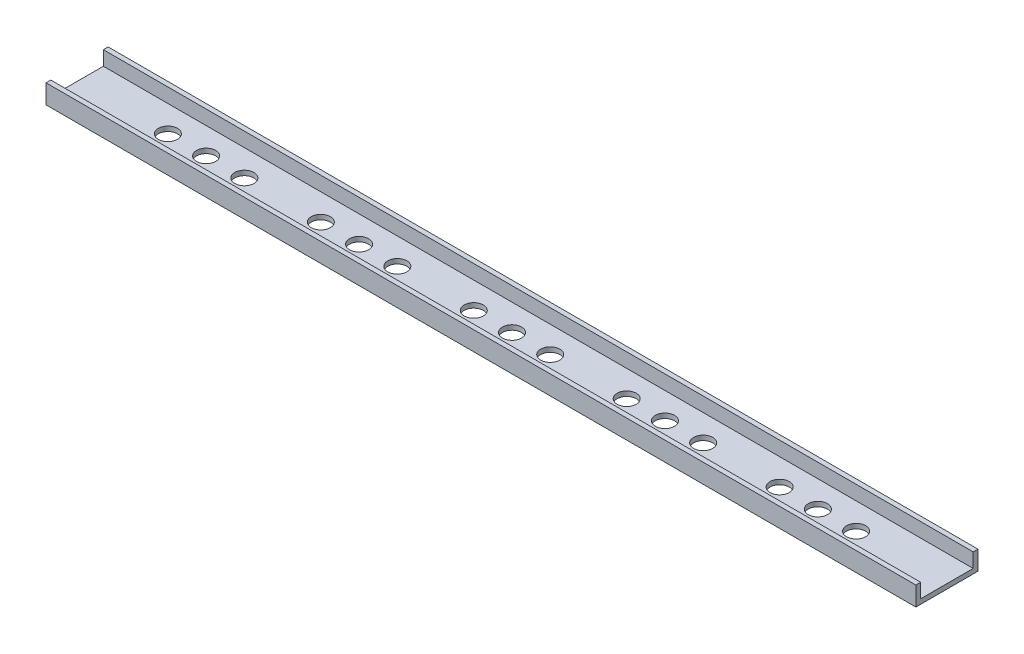
ISO-10303-21;
HEADER;
FILE_DESCRIPTION(('STEP AP214'),'2;1');
FILE_NAME('part.step','',(''),(''),'','','');
FILE_SCHEMA(('AUTOMOTIVE_DESIGN { 1 0 10303 214 1 1 1 1 }'));
ENDSEC;
DATA;
#1=APPLICATION_CONTEXT('core data for automotive mechanical design processes');
#2=APPLICATION_PROTOCOL_DEFINITION('international standard','automotive_design',2000,#1);
#3=PRODUCT_CONTEXT('',#1,'mechanical');
#4=PRODUCT('Part','Part','',(#3));
#5=PRODUCT_RELATED_PRODUCT_CATEGORY('part','',(#4));
#6=PRODUCT_DEFINITION_FORMATION('','',#4);
#7=PRODUCT_DEFINITION_CONTEXT('part definition',#1,'design');
#8=PRODUCT_DEFINITION('design','',#6,#7);
#9=PRODUCT_DEFINITION_SHAPE('','',#8);
#10=(LENGTH_UNIT() NAMED_UNIT(*) SI_UNIT(.MILLI.,.METRE.));
#11=(NAMED_UNIT(*) PLANE_ANGLE_UNIT() SI_UNIT($,.RADIAN.));
#12=(NAMED_UNIT(*) SI_UNIT($,.STERADIAN.) SOLID_ANGLE_UNIT());
#13=UNCERTAINTY_MEASURE_WITH_UNIT(LENGTH_MEASURE(1.E-05),#10,'distance_accuracy_value','');
#14=(GEOMETRIC_REPRESENTATION_CONTEXT(3) GLOBAL_UNCERTAINTY_ASSIGNED_CONTEXT((#13)) GLOBAL_UNIT_ASSIGNED_CONTEXT((#10,
#11,#12)) REPRESENTATION_CONTEXT('',''));
#15=CARTESIAN_POINT('',(0.,0.,0.));
#16=DIRECTION('',(0.,0.,1.));
#17=DIRECTION('',(1.,0.,0.));
#18=AXIS2_PLACEMENT_3D('',#15,#16,#17);
#19=CARTESIAN_POINT('',(0.,1.,0.));
#20=DIRECTION('',(0.,1.,0.));
#21=DIRECTION('',(0.,0.,1.));
#22=AXIS2_PLACEMENT_3D('',#19,#20,#21);
#23=PLANE('',#22);
#24=CARTESIAN_POINT('',(64.,1.,-44.1536914511489));
#25=DIRECTION('',(0.,1.,0.));
#26=DIRECTION('',(0.,0.,1.));
#27=AXIS2_PLACEMENT_3D('',#24,#25,#26);
#28=CIRCLE('',#27,2.);
#29=CARTESIAN_POINT('',(64.,1.,-42.1536914511489));
#30=VERTEX_POINT('',#29);
#31=EDGE_CURVE('E151',#30,#30,#28,.T.);
#32=ORIENTED_EDGE('',*,*,#31,.F.);
#33=EDGE_LOOP('',(#32));
#34=FACE_BOUND('',#33,.T.);
#35=CARTESIAN_POINT('',(-7.99999999999998,1.,-44.1536914511489));
#36=DIRECTION('',(0.,1.,0.));
#37=DIRECTION('',(0.,0.,-1.));
#38=AXIS2_PLACEMENT_3D('',#35,#36,#37);
#39=CIRCLE('',#38,2.);
#40=CARTESIAN_POINT('',(-7.99999999999998,1.,-46.1536914511489));
#41=VERTEX_POINT('',#40);
#42=EDGE_CURVE('E163',#41,#41,#39,.T.);
#43=ORIENTED_EDGE('',*,*,#42,.F.);
#44=EDGE_LOOP('',(#43));
#45=FACE_BOUND('',#44,.T.);
#46=CARTESIAN_POINT('',(8.00000000000003,1.,-44.1536914511489));
#47=DIRECTION('',(0.,1.,0.));
#48=DIRECTION('',(0.,0.,-1.));
#49=AXIS2_PLACEMENT_3D('',#46,#47,#48);
#50=CIRCLE('',#49,2.);
#51=CARTESIAN_POINT('',(8.00000000000003,1.,-46.1536914511489));
#52=VERTEX_POINT('',#51);
#53=EDGE_CURVE('E175',#52,#52,#50,.T.);
#54=ORIENTED_EDGE('',*,*,#53,.F.);
#55=EDGE_LOOP('',(#54));
#56=FACE_BOUND('',#55,.T.);
#57=CARTESIAN_POINT('',(32.,1.,-44.1536914511489));
#58=DIRECTION('',(0.,1.,0.));
#59=DIRECTION('',(0.,0.,-1.));
#60=AXIS2_PLACEMENT_3D('',#57,#58,#59);
#61=CIRCLE('',#60,2.);
#62=CARTESIAN_POINT('',(32.,1.,-46.1536914511489));
#63=VERTEX_POINT('',#62);
#64=EDGE_CURVE('E187',#63,#63,#61,.T.);
#65=ORIENTED_EDGE('',*,*,#64,.F.);
#66=EDGE_LOOP('',(#65));
#67=FACE_BOUND('',#66,.T.);
#68=CARTESIAN_POINT('',(-24.,1.,-44.1536914511489));
#69=DIRECTION('',(0.,1.,0.));
#70=DIRECTION('',(0.,0.,1.));
#71=AXIS2_PLACEMENT_3D('',#68,#69,#70);
#72=CIRCLE('',#71,2.);
#73=CARTESIAN_POINT('',(-24.,1.,-42.1536914511489));
#74=VERTEX_POINT('',#73);
#75=EDGE_CURVE('E199',#74,#74,#72,.T.);
#76=ORIENTED_EDGE('',*,*,#75,.F.);
#77=EDGE_LOOP('',(#76));
#78=FACE_BOUND('',#77,.T.);
#79=CARTESIAN_POINT('',(-40.,1.,-44.1536914511489));
#80=DIRECTION('',(0.,1.,0.));
#81=DIRECTION('',(0.,0.,1.));
#82=AXIS2_PLACEMENT_3D('',#79,#80,#81);
#83=CIRCLE('',#82,2.);
#84=CARTESIAN_POINT('',(-40.,1.,-42.1536914511489));
#85=VERTEX_POINT('',#84);
#86=EDGE_CURVE('E211',#85,#85,#83,.T.);
#87=ORIENTED_EDGE('',*,*,#86,.F.);
#88=EDGE_LOOP('',(#87));
#89=FACE_BOUND('',#88,.T.);
#90=CARTESIAN_POINT('',(-64.,1.,-44.1536914511489));
#91=DIRECTION('',(0.,1.,0.));
#92=DIRECTION('',(0.,0.,1.));
#93=AXIS2_PLACEMENT_3D('',#90,#91,#92);
#94=CIRCLE('',#93,2.);
#95=CARTESIAN_POINT('',(-64.,1.,-42.1536914511489));
#96=VERTEX_POINT('',#95);
#97=EDGE_CURVE('E223',#96,#96,#94,.T.);
#98=ORIENTED_EDGE('',*,*,#97,.F.);
#99=EDGE_LOOP('',(#98));
#100=FACE_BOUND('',#99,.T.);
#101=CARTESIAN_POINT('',(-72.,1.,-44.1536914511489));
#102=DIRECTION('',(0.,1.,0.));
#103=DIRECTION('',(0.,0.,1.));
#104=AXIS2_PLACEMENT_3D('',#101,#102,#103);
#105=CIRCLE('',#104,2.);
#106=CARTESIAN_POINT('',(-72.,1.,-42.1536914511489));
#107=VERTEX_POINT('',#106);
#108=EDGE_CURVE('E229',#107,#107,#105,.T.);
#109=ORIENTED_EDGE('',*,*,#108,.F.);
#110=EDGE_LOOP('',(#109));
#111=FACE_BOUND('',#110,.T.);
#112=CARTESIAN_POINT('',(-56.,1.,-44.1536914511489));
#113=DIRECTION('',(0.,1.,0.));
#114=DIRECTION('',(0.,0.,1.));
#115=AXIS2_PLACEMENT_3D('',#112,#113,#114);
#116=CIRCLE('',#115,2.);
#117=CARTESIAN_POINT('',(-56.,1.,-42.1536914511489));
#118=VERTEX_POINT('',#117);
#119=EDGE_CURVE('E217',#118,#118,#116,.T.);
#120=ORIENTED_EDGE('',*,*,#119,.F.);
#121=EDGE_LOOP('',(#120));
#122=FACE_BOUND('',#121,.T.);
#123=CARTESIAN_POINT('',(-32.,1.,-44.1536914511489));
#124=DIRECTION('',(0.,1.,0.));
#125=DIRECTION('',(0.,0.,1.));
#126=AXIS2_PLACEMENT_3D('',#123,#124,#125);
#127=CIRCLE('',#126,2.);
#128=CARTESIAN_POINT('',(-32.,1.,-42.1536914511489));
#129=VERTEX_POINT('',#128);
#130=EDGE_CURVE('E205',#129,#129,#127,.T.);
#131=ORIENTED_EDGE('',*,*,#130,.F.);
#132=EDGE_LOOP('',(#131));
#133=FACE_BOUND('',#132,.T.);
#134=CARTESIAN_POINT('',(40.,1.,-44.1536914511489));
#135=DIRECTION('',(0.,1.,0.));
#136=DIRECTION('',(0.,0.,-1.));
#137=AXIS2_PLACEMENT_3D('',#134,#135,#136);
#138=CIRCLE('',#137,2.);
#139=CARTESIAN_POINT('',(40.,1.,-46.1536914511489));
#140=VERTEX_POINT('',#139);
#141=EDGE_CURVE('E193',#140,#140,#138,.T.);
#142=ORIENTED_EDGE('',*,*,#141,.F.);
#143=EDGE_LOOP('',(#142));
#144=FACE_BOUND('',#143,.T.);
#145=CARTESIAN_POINT('',(24.,1.,-44.1536914511489));
#146=DIRECTION('',(0.,1.,0.));
#147=DIRECTION('',(0.,0.,-1.));
#148=AXIS2_PLACEMENT_3D('',#145,#146,#147);
#149=CIRCLE('',#148,2.);
#150=CARTESIAN_POINT('',(24.,1.,-46.1536914511489));
#151=VERTEX_POINT('',#150);
#152=EDGE_CURVE('E181',#151,#151,#149,.T.);
#153=ORIENTED_EDGE('',*,*,#152,.F.);
#154=EDGE_LOOP('',(#153));
#155=FACE_BOUND('',#154,.T.);
#156=CARTESIAN_POINT('',(0.,1.,-44.1536914511489));
#157=DIRECTION('',(0.,1.,0.));
#158=DIRECTION('',(0.,0.,-1.));
#159=AXIS2_PLACEMENT_3D('',#156,#157,#158);
#160=CIRCLE('',#159,2.);
#161=CARTESIAN_POINT('',(0.,1.,-46.1536914511489));
#162=VERTEX_POINT('',#161);
#163=EDGE_CURVE('E169',#162,#162,#160,.T.);
#164=ORIENTED_EDGE('',*,*,#163,.F.);
#165=EDGE_LOOP('',(#164));
#166=FACE_BOUND('',#165,.T.);
#167=CARTESIAN_POINT('',(72.,1.,-44.1536914511489));
#168=DIRECTION('',(0.,1.,0.));
#169=DIRECTION('',(0.,0.,1.));
#170=AXIS2_PLACEMENT_3D('',#167,#168,#169);
#171=CIRCLE('',#170,2.);
#172=CARTESIAN_POINT('',(72.,1.,-42.1536914511489));
#173=VERTEX_POINT('',#172);
#174=EDGE_CURVE('E157',#173,#173,#171,.T.);
#175=ORIENTED_EDGE('',*,*,#174,.F.);
#176=EDGE_LOOP('',(#175));
#177=FACE_BOUND('',#176,.T.);
#178=CARTESIAN_POINT('',(56.,1.,-44.1536914511489));
#179=DIRECTION('',(0.,1.,0.));
#180=DIRECTION('',(0.,0.,1.));
#181=AXIS2_PLACEMENT_3D('',#178,#179,#180);
#182=CIRCLE('',#181,2.);
#183=CARTESIAN_POINT('',(56.,1.,-42.1536914511489));
#184=VERTEX_POINT('',#183);
#185=EDGE_CURVE('E145',#184,#184,#182,.T.);
#186=ORIENTED_EDGE('',*,*,#185,.F.);
#187=EDGE_LOOP('',(#186));
#188=FACE_BOUND('',#187,.T.);
#189=DIRECTION('',(0.,0.,1.));
#190=VECTOR('',#189,1.);
#191=CARTESIAN_POINT('',(-91.,1.,-50.6536914511489));
#192=LINE('',#191,#190);
#193=CARTESIAN_POINT('',(-91.,1.,-49.6536914511489));
#194=VERTEX_POINT('',#193);
#195=CARTESIAN_POINT('',(-91.,1.,-38.6536914511489));
#196=VERTEX_POINT('',#195);
#197=EDGE_CURVE('E49',#194,#196,#192,.T.);
#198=ORIENTED_EDGE('',*,*,#197,.T.);
#199=DIRECTION('',(-1.,0.,0.));
#200=VECTOR('',#199,1.);
#201=CARTESIAN_POINT('',(91.,1.,-38.6536914511489));
#202=LINE('',#201,#200);
#203=CARTESIAN_POINT('',(91.,1.,-38.6536914511489));
#204=VERTEX_POINT('',#203);
#205=EDGE_CURVE('E118',#204,#196,#202,.T.);
#206=ORIENTED_EDGE('',*,*,#205,.F.);
#207=DIRECTION('',(0.,0.,-1.));
#208=VECTOR('',#207,1.);
#209=CARTESIAN_POINT('',(91.,1.,-50.6536914511489));
#210=LINE('',#209,#208);
#211=CARTESIAN_POINT('',(91.,1.,-49.6536914511489));
#212=VERTEX_POINT('',#211);
#213=EDGE_CURVE('E122',#204,#212,#210,.T.);
#214=ORIENTED_EDGE('',*,*,#213,.T.);
#215=DIRECTION('',(1.,0.,0.));
#216=VECTOR('',#215,1.);
#217=CARTESIAN_POINT('',(-91.,1.,-49.6536914511489));
#218=LINE('',#217,#216);
#219=EDGE_CURVE('E54',#194,#212,#218,.T.);
#220=ORIENTED_EDGE('',*,*,#219,.F.);
#221=EDGE_LOOP('',(#198,#206,#214,#220));
#222=FACE_BOUND('',#221,.T.);
#223=ADVANCED_FACE('F34',(#34,#45,#56,#67,#78,#89,#100,#111,#122,#133,#144,#155,#166,#177,#188,
#222),#23,.T.);
#224=CARTESIAN_POINT('',(0.,0.,0.));
#225=DIRECTION('',(0.,1.,0.));
#226=DIRECTION('',(0.,0.,1.));
#227=AXIS2_PLACEMENT_3D('',#224,#225,#226);
#228=PLANE('',#227);
#229=DIRECTION('',(0.,0.,1.));
#230=VECTOR('',#229,1.);
#231=CARTESIAN_POINT('',(-91.,0.,-50.6536914511489));
#232=LINE('',#231,#230);
#233=CARTESIAN_POINT('',(-91.,0.,-50.6536914511489));
#234=VERTEX_POINT('',#233);
#235=CARTESIAN_POINT('',(-91.,0.,-37.6536914511489));
#236=VERTEX_POINT('',#235);
#237=EDGE_CURVE('E232',#234,#236,#232,.T.);
#238=ORIENTED_EDGE('',*,*,#237,.F.);
#239=DIRECTION('',(-1.,0.,0.));
#240=VECTOR('',#239,1.);
#241=CARTESIAN_POINT('',(-91.,0.,-50.6536914511489));
#242=LINE('',#241,#240);
#243=CARTESIAN_POINT('',(91.,0.,-50.6536914511489));
#244=VERTEX_POINT('',#243);
#245=EDGE_CURVE('E236',#244,#234,#242,.T.);
#246=ORIENTED_EDGE('',*,*,#245,.F.);
#247=DIRECTION('',(0.,0.,-1.));
#248=VECTOR('',#247,1.);
#249=CARTESIAN_POINT('',(91.,0.,-50.6536914511489));
#250=LINE('',#249,#248);
#251=CARTESIAN_POINT('',(91.,0.,-37.6536914511489));
#252=VERTEX_POINT('',#251);
#253=EDGE_CURVE('E243',#252,#244,#250,.T.);
#254=ORIENTED_EDGE('',*,*,#253,.F.);
#255=DIRECTION('',(1.,0.,0.));
#256=VECTOR('',#255,1.);
#257=CARTESIAN_POINT('',(-91.,0.,-37.6536914511489));
#258=LINE('',#257,#256);
#259=EDGE_CURVE('E241',#236,#252,#258,.T.);
#260=ORIENTED_EDGE('',*,*,#259,.F.);
#261=EDGE_LOOP('',(#238,#246,#254,#260));
#262=FACE_BOUND('',#261,.T.);
#263=CARTESIAN_POINT('',(-72.,0.,-44.1536914511489));
#264=DIRECTION('',(0.,1.,0.));
#265=DIRECTION('',(0.,0.,1.));
#266=AXIS2_PLACEMENT_3D('',#263,#264,#265);
#267=CIRCLE('',#266,2.);
#268=CARTESIAN_POINT('',(-72.,0.,-42.1536914511489));
#269=VERTEX_POINT('',#268);
#270=EDGE_CURVE('E226',#269,#269,#267,.T.);
#271=ORIENTED_EDGE('',*,*,#270,.T.);
#272=EDGE_LOOP('',(#271));
#273=FACE_BOUND('',#272,.T.);
#274=CARTESIAN_POINT('',(-64.,0.,-44.1536914511489));
#275=DIRECTION('',(0.,1.,0.));
#276=DIRECTION('',(0.,0.,1.));
#277=AXIS2_PLACEMENT_3D('',#274,#275,#276);
#278=CIRCLE('',#277,2.);
#279=CARTESIAN_POINT('',(-64.,0.,-42.1536914511489));
#280=VERTEX_POINT('',#279);
#281=EDGE_CURVE('E220',#280,#280,#278,.T.);
#282=ORIENTED_EDGE('',*,*,#281,.T.);
#283=EDGE_LOOP('',(#282));
#284=FACE_BOUND('',#283,.T.);
#285=CARTESIAN_POINT('',(-56.,0.,-44.1536914511489));
#286=DIRECTION('',(0.,1.,0.));
#287=DIRECTION('',(0.,0.,1.));
#288=AXIS2_PLACEMENT_3D('',#285,#286,#287);
#289=CIRCLE('',#288,2.);
#290=CARTESIAN_POINT('',(-56.,0.,-42.1536914511489));
#291=VERTEX_POINT('',#290);
#292=EDGE_CURVE('E214',#291,#291,#289,.T.);
#293=ORIENTED_EDGE('',*,*,#292,.T.);
#294=EDGE_LOOP('',(#293));
#295=FACE_BOUND('',#294,.T.);
#296=CARTESIAN_POINT('',(-40.,0.,-44.1536914511489));
#297=DIRECTION('',(0.,1.,0.));
#298=DIRECTION('',(0.,0.,1.));
#299=AXIS2_PLACEMENT_3D('',#296,#297,#298);
#300=CIRCLE('',#299,2.);
#301=CARTESIAN_POINT('',(-40.,0.,-42.1536914511489));
#302=VERTEX_POINT('',#301);
#303=EDGE_CURVE('E208',#302,#302,#300,.T.);
#304=ORIENTED_EDGE('',*,*,#303,.T.);
#305=EDGE_LOOP('',(#304));
#306=FACE_BOUND('',#305,.T.);
#307=CARTESIAN_POINT('',(-32.,0.,-44.1536914511489));
#308=DIRECTION('',(0.,1.,0.));
#309=DIRECTION('',(0.,0.,1.));
#310=AXIS2_PLACEMENT_3D('',#307,#308,#309);
#311=CIRCLE('',#310,2.);
#312=CARTESIAN_POINT('',(-32.,0.,-42.1536914511489));
#313=VERTEX_POINT('',#312);
#314=EDGE_CURVE('E202',#313,#313,#311,.T.);
#315=ORIENTED_EDGE('',*,*,#314,.T.);
#316=EDGE_LOOP('',(#315));
#317=FACE_BOUND('',#316,.T.);
#318=CARTESIAN_POINT('',(-24.,0.,-44.1536914511489));
#319=DIRECTION('',(0.,1.,0.));
#320=DIRECTION('',(0.,0.,1.));
#321=AXIS2_PLACEMENT_3D('',#318,#319,#320);
#322=CIRCLE('',#321,2.);
#323=CARTESIAN_POINT('',(-24.,0.,-42.1536914511489));
#324=VERTEX_POINT('',#323);
#325=EDGE_CURVE('E196',#324,#324,#322,.T.);
#326=ORIENTED_EDGE('',*,*,#325,.T.);
#327=EDGE_LOOP('',(#326));
#328=FACE_BOUND('',#327,.T.);
#329=CARTESIAN_POINT('',(40.,0.,-44.1536914511489));
#330=DIRECTION('',(0.,1.,0.));
#331=DIRECTION('',(0.,0.,-1.));
#332=AXIS2_PLACEMENT_3D('',#329,#330,#331);
#333=CIRCLE('',#332,2.);
#334=CARTESIAN_POINT('',(40.,0.,-46.1536914511489));
#335=VERTEX_POINT('',#334);
#336=EDGE_CURVE('E190',#335,#335,#333,.T.);
#337=ORIENTED_EDGE('',*,*,#336,.T.);
#338=EDGE_LOOP('',(#337));
#339=FACE_BOUND('',#338,.T.);
#340=CARTESIAN_POINT('',(32.,0.,-44.1536914511489));
#341=DIRECTION('',(0.,1.,0.));
#342=DIRECTION('',(0.,0.,-1.));
#343=AXIS2_PLACEMENT_3D('',#340,#341,#342);
#344=CIRCLE('',#343,2.);
#345=CARTESIAN_POINT('',(32.,0.,-46.1536914511489));
#346=VERTEX_POINT('',#345);
#347=EDGE_CURVE('E184',#346,#346,#344,.T.);
#348=ORIENTED_EDGE('',*,*,#347,.T.);
#349=EDGE_LOOP('',(#348));
#350=FACE_BOUND('',#349,.T.);
#351=CARTESIAN_POINT('',(24.,0.,-44.1536914511489));
#352=DIRECTION('',(0.,1.,0.));
#353=DIRECTION('',(0.,0.,-1.));
#354=AXIS2_PLACEMENT_3D('',#351,#352,#353);
#355=CIRCLE('',#354,2.);
#356=CARTESIAN_POINT('',(24.,0.,-46.1536914511489));
#357=VERTEX_POINT('',#356);
#358=EDGE_CURVE('E178',#357,#357,#355,.T.);
#359=ORIENTED_EDGE('',*,*,#358,.T.);
#360=EDGE_LOOP('',(#359));
#361=FACE_BOUND('',#360,.T.);
#362=CARTESIAN_POINT('',(8.00000000000003,0.,-44.1536914511489));
#363=DIRECTION('',(0.,1.,0.));
#364=DIRECTION('',(0.,0.,-1.));
#365=AXIS2_PLACEMENT_3D('',#362,#363,#364);
#366=CIRCLE('',#365,2.);
#367=CARTESIAN_POINT('',(8.00000000000003,0.,-46.1536914511489));
#368=VERTEX_POINT('',#367);
#369=EDGE_CURVE('E172',#368,#368,#366,.T.);
#370=ORIENTED_EDGE('',*,*,#369,.T.);
#371=EDGE_LOOP('',(#370));
#372=FACE_BOUND('',#371,.T.);
#373=CARTESIAN_POINT('',(0.,0.,-44.1536914511489));
#374=DIRECTION('',(0.,1.,0.));
#375=DIRECTION('',(0.,0.,-1.));
#376=AXIS2_PLACEMENT_3D('',#373,#374,#375);
#377=CIRCLE('',#376,2.);
#378=CARTESIAN_POINT('',(0.,0.,-46.1536914511489));
#379=VERTEX_POINT('',#378);
#380=EDGE_CURVE('E166',#379,#379,#377,.T.);
#381=ORIENTED_EDGE('',*,*,#380,.T.);
#382=EDGE_LOOP('',(#381));
#383=FACE_BOUND('',#382,.T.);
#384=CARTESIAN_POINT('',(-7.99999999999998,0.,-44.1536914511489));
#385=DIRECTION('',(0.,1.,0.));
#386=DIRECTION('',(0.,0.,-1.));
#387=AXIS2_PLACEMENT_3D('',#384,#385,#386);
#388=CIRCLE('',#387,2.);
#389=CARTESIAN_POINT('',(-7.99999999999998,0.,-46.1536914511489));
#390=VERTEX_POINT('',#389);
#391=EDGE_CURVE('E160',#390,#390,#388,.T.);
#392=ORIENTED_EDGE('',*,*,#391,.T.);
#393=EDGE_LOOP('',(#392));
#394=FACE_BOUND('',#393,.T.);
#395=CARTESIAN_POINT('',(72.,0.,-44.1536914511489));
#396=DIRECTION('',(0.,1.,0.));
#397=DIRECTION('',(0.,0.,1.));
#398=AXIS2_PLACEMENT_3D('',#395,#396,#397);
#399=CIRCLE('',#398,2.);
#400=CARTESIAN_POINT('',(72.,0.,-42.1536914511489));
#401=VERTEX_POINT('',#400);
#402=EDGE_CURVE('E154',#401,#401,#399,.T.);
#403=ORIENTED_EDGE('',*,*,#402,.T.);
#404=EDGE_LOOP('',(#403));
#405=FACE_BOUND('',#404,.T.);
#406=CARTESIAN_POINT('',(64.,0.,-44.1536914511489));
#407=DIRECTION('',(0.,1.,0.));
#408=DIRECTION('',(0.,0.,1.));
#409=AXIS2_PLACEMENT_3D('',#406,#407,#408);
#410=CIRCLE('',#409,2.);
#411=CARTESIAN_POINT('',(64.,0.,-42.1536914511489));
#412=VERTEX_POINT('',#411);
#413=EDGE_CURVE('E148',#412,#412,#410,.T.);
#414=ORIENTED_EDGE('',*,*,#413,.T.);
#415=EDGE_LOOP('',(#414));
#416=FACE_BOUND('',#415,.T.);
#417=CARTESIAN_POINT('',(56.,0.,-44.1536914511489));
#418=DIRECTION('',(0.,1.,0.));
#419=DIRECTION('',(0.,0.,1.));
#420=AXIS2_PLACEMENT_3D('',#417,#418,#419);
#421=CIRCLE('',#420,2.);
#422=CARTESIAN_POINT('',(56.,0.,-42.1536914511489));
#423=VERTEX_POINT('',#422);
#424=EDGE_CURVE('E144',#423,#423,#421,.T.);
#425=ORIENTED_EDGE('',*,*,#424,.T.);
#426=EDGE_LOOP('',(#425));
#427=FACE_BOUND('',#426,.T.);
#428=ADVANCED_FACE('F255',(#262,#273,#284,#295,#306,#317,#328,#339,#350,#361,#372,#383,#394,
#405,#416,#427),#228,.F.);
#429=CARTESIAN_POINT('',(-91.,1.,-50.6536914511489));
#430=DIRECTION('',(1.,0.,0.));
#431=DIRECTION('',(0.,0.,-1.));
#432=AXIS2_PLACEMENT_3D('',#429,#430,#431);
#433=PLANE('',#432);
#434=ORIENTED_EDGE('',*,*,#237,.T.);
#435=DIRECTION('',(0.,-1.,0.));
#436=VECTOR('',#435,1.);
#437=CARTESIAN_POINT('',(-91.,1.,-37.6536914511489));
#438=LINE('',#437,#436);
#439=CARTESIAN_POINT('',(-91.,4.,-37.6536914511489));
#440=VERTEX_POINT('',#439);
#441=EDGE_CURVE('E11',#440,#236,#438,.T.);
#442=ORIENTED_EDGE('',*,*,#441,.F.);
#443=DIRECTION('',(0.,0.,1.));
#444=VECTOR('',#443,1.);
#445=CARTESIAN_POINT('',(-91.,4.,-37.6536914511489));
#446=LINE('',#445,#444);
#447=CARTESIAN_POINT('',(-91.,4.,-38.6536914511489));
#448=VERTEX_POINT('',#447);
#449=EDGE_CURVE('E108',#448,#440,#446,.T.);
#450=ORIENTED_EDGE('',*,*,#449,.F.);
#451=DIRECTION('',(0.,-1.,0.));
#452=VECTOR('',#451,1.);
#453=CARTESIAN_POINT('',(-91.,4.,-38.6536914511489));
#454=LINE('',#453,#452);
#455=EDGE_CURVE('E104',#448,#196,#454,.T.);
#456=ORIENTED_EDGE('',*,*,#455,.T.);
#457=ORIENTED_EDGE('',*,*,#197,.F.);
#458=DIRECTION('',(0.,-1.,0.));
#459=VECTOR('',#458,1.);
#460=CARTESIAN_POINT('',(-91.,4.,-49.6536914511489));
#461=LINE('',#460,#459);
#462=CARTESIAN_POINT('',(-91.,4.,-49.6536914511489));
#463=VERTEX_POINT('',#462);
#464=EDGE_CURVE('E141',#463,#194,#461,.T.);
#465=ORIENTED_EDGE('',*,*,#464,.F.);
#466=DIRECTION('',(0.,0.,1.));
#467=VECTOR('',#466,1.);
#468=CARTESIAN_POINT('',(-91.,4.,-50.6536914511489));
#469=LINE('',#468,#467);
#470=CARTESIAN_POINT('',(-91.,4.,-50.6536914511489));
#471=VERTEX_POINT('',#470);
#472=EDGE_CURVE('E124',#471,#463,#469,.T.);
#473=ORIENTED_EDGE('',*,*,#472,.F.);
#474=DIRECTION('',(0.,-1.,0.));
#475=VECTOR('',#474,1.);
#476=CARTESIAN_POINT('',(-91.,1.,-50.6536914511489));
#477=LINE('',#476,#475);
#478=EDGE_CURVE('E238',#471,#234,#477,.T.);
#479=ORIENTED_EDGE('',*,*,#478,.T.);
#480=EDGE_LOOP('',(#434,#442,#450,#456,#457,#465,#473,#479));
#481=FACE_BOUND('',#480,.T.);
#482=ADVANCED_FACE('F36',(#481),#433,.F.);
#483=CARTESIAN_POINT('',(-91.,1.,-37.6536914511489));
#484=DIRECTION('',(0.,0.,-1.));
#485=DIRECTION('',(-1.,0.,0.));
#486=AXIS2_PLACEMENT_3D('',#483,#484,#485);
#487=PLANE('',#486);
#488=ORIENTED_EDGE('',*,*,#259,.T.);
#489=DIRECTION('',(0.,-1.,0.));
#490=VECTOR('',#489,1.);
#491=CARTESIAN_POINT('',(91.,1.,-37.6536914511489));
#492=LINE('',#491,#490);
#493=CARTESIAN_POINT('',(91.,4.,-37.6536914511489));
#494=VERTEX_POINT('',#493);
#495=EDGE_CURVE('E42',#494,#252,#492,.T.);
#496=ORIENTED_EDGE('',*,*,#495,.F.);
#497=DIRECTION('',(1.,0.,0.));
#498=VECTOR('',#497,1.);
#499=CARTESIAN_POINT('',(91.,4.,-37.6536914511489));
#500=LINE('',#499,#498);
#501=EDGE_CURVE('E115',#440,#494,#500,.T.);
#502=ORIENTED_EDGE('',*,*,#501,.F.);
#503=ORIENTED_EDGE('',*,*,#441,.T.);
#504=EDGE_LOOP('',(#488,#496,#502,#503));
#505=FACE_BOUND('',#504,.T.);
#506=ADVANCED_FACE('F296',(#505),#487,.F.);
#507=CARTESIAN_POINT('',(91.,1.,-50.6536914511489));
#508=DIRECTION('',(-1.,0.,0.));
#509=DIRECTION('',(0.,0.,1.));
#510=AXIS2_PLACEMENT_3D('',#507,#508,#509);
#511=PLANE('',#510);
#512=ORIENTED_EDGE('',*,*,#253,.T.);
#513=DIRECTION('',(0.,-1.,0.));
#514=VECTOR('',#513,1.);
#515=CARTESIAN_POINT('',(91.,1.,-50.6536914511489));
#516=LINE('',#515,#514);
#517=CARTESIAN_POINT('',(91.,4.,-50.6536914511489));
#518=VERTEX_POINT('',#517);
#519=EDGE_CURVE('E248',#518,#244,#516,.T.);
#520=ORIENTED_EDGE('',*,*,#519,.F.);
#521=DIRECTION('',(0.,0.,-1.));
#522=VECTOR('',#521,1.);
#523=CARTESIAN_POINT('',(91.,4.,-50.6536914511489));
#524=LINE('',#523,#522);
#525=CARTESIAN_POINT('',(91.,4.,-49.6536914511489));
#526=VERTEX_POINT('',#525);
#527=EDGE_CURVE('E133',#526,#518,#524,.T.);
#528=ORIENTED_EDGE('',*,*,#527,.F.);
#529=DIRECTION('',(0.,-1.,0.));
#530=VECTOR('',#529,1.);
#531=CARTESIAN_POINT('',(91.,4.,-49.6536914511489));
#532=LINE('',#531,#530);
#533=EDGE_CURVE('E138',#526,#212,#532,.T.);
#534=ORIENTED_EDGE('',*,*,#533,.T.);
#535=ORIENTED_EDGE('',*,*,#213,.F.);
#536=DIRECTION('',(0.,-1.,0.));
#537=VECTOR('',#536,1.);
#538=CARTESIAN_POINT('',(91.,4.,-38.6536914511489));
#539=LINE('',#538,#537);
#540=CARTESIAN_POINT('',(91.,4.,-38.6536914511489));
#541=VERTEX_POINT('',#540);
#542=EDGE_CURVE('E102',#541,#204,#539,.T.);
#543=ORIENTED_EDGE('',*,*,#542,.F.);
#544=DIRECTION('',(0.,0.,-1.));
#545=VECTOR('',#544,1.);
#546=CARTESIAN_POINT('',(91.,4.,-37.6536914511489));
#547=LINE('',#546,#545);
#548=EDGE_CURVE('E109',#494,#541,#547,.T.);
#549=ORIENTED_EDGE('',*,*,#548,.F.);
#550=ORIENTED_EDGE('',*,*,#495,.T.);
#551=EDGE_LOOP('',(#512,#520,#528,#534,#535,#543,#549,#550));
#552=FACE_BOUND('',#551,.T.);
#553=ADVANCED_FACE('F120',(#552),#511,.F.);
#554=CARTESIAN_POINT('',(-91.,1.,-50.6536914511489));
#555=DIRECTION('',(0.,0.,1.));
#556=DIRECTION('',(1.,0.,0.));
#557=AXIS2_PLACEMENT_3D('',#554,#555,#556);
#558=PLANE('',#557);
#559=ORIENTED_EDGE('',*,*,#245,.T.);
#560=ORIENTED_EDGE('',*,*,#478,.F.);
#561=DIRECTION('',(-1.,0.,0.));
#562=VECTOR('',#561,1.);
#563=CARTESIAN_POINT('',(-91.,4.,-50.6536914511489));
#564=LINE('',#563,#562);
#565=EDGE_CURVE('E136',#518,#471,#564,.T.);
#566=ORIENTED_EDGE('',*,*,#565,.F.);
#567=ORIENTED_EDGE('',*,*,#519,.T.);
#568=EDGE_LOOP('',(#559,#560,#566,#567));
#569=FACE_BOUND('',#568,.T.);
#570=ADVANCED_FACE('F258',(#569),#558,.F.);
#571=CARTESIAN_POINT('',(-72.,1.,-44.1536914511489));
#572=DIRECTION('',(0.,-1.,0.));
#573=DIRECTION('',(0.,0.,-1.));
#574=AXIS2_PLACEMENT_3D('',#571,#572,#573);
#575=CYLINDRICAL_SURFACE('',#574,2.);
#576=ORIENTED_EDGE('',*,*,#108,.T.);
#577=EDGE_LOOP('',(#576));
#578=FACE_BOUND('',#577,.T.);
#579=ORIENTED_EDGE('',*,*,#270,.F.);
#580=EDGE_LOOP('',(#579));
#581=FACE_BOUND('',#580,.T.);
#582=ADVANCED_FACE('F290',(#578,#581),#575,.F.);
#583=CARTESIAN_POINT('',(-64.,1.,-44.1536914511489));
#584=DIRECTION('',(0.,-1.,0.));
#585=DIRECTION('',(0.,0.,-1.));
#586=AXIS2_PLACEMENT_3D('',#583,#584,#585);
#587=CYLINDRICAL_SURFACE('',#586,2.);
#588=ORIENTED_EDGE('',*,*,#97,.T.);
#589=EDGE_LOOP('',(#588));
#590=FACE_BOUND('',#589,.T.);
#591=ORIENTED_EDGE('',*,*,#281,.F.);
#592=EDGE_LOOP('',(#591));
#593=FACE_BOUND('',#592,.T.);
#594=ADVANCED_FACE('F349',(#590,#593),#587,.F.);
#595=CARTESIAN_POINT('',(-56.,1.,-44.1536914511489));
#596=DIRECTION('',(0.,-1.,0.));
#597=DIRECTION('',(0.,0.,-1.));
#598=AXIS2_PLACEMENT_3D('',#595,#596,#597);
#599=CYLINDRICAL_SURFACE('',#598,2.);
#600=ORIENTED_EDGE('',*,*,#119,.T.);
#601=EDGE_LOOP('',(#600));
#602=FACE_BOUND('',#601,.T.);
#603=ORIENTED_EDGE('',*,*,#292,.F.);
#604=EDGE_LOOP('',(#603));
#605=FACE_BOUND('',#604,.T.);
#606=ADVANCED_FACE('F358',(#602,#605),#599,.F.);
#607=CARTESIAN_POINT('',(-40.,1.,-44.1536914511489));
#608=DIRECTION('',(0.,-1.,0.));
#609=DIRECTION('',(0.,0.,-1.));
#610=AXIS2_PLACEMENT_3D('',#607,#608,#609);
#611=CYLINDRICAL_SURFACE('',#610,2.);
#612=ORIENTED_EDGE('',*,*,#86,.T.);
#613=EDGE_LOOP('',(#612));
#614=FACE_BOUND('',#613,.T.);
#615=ORIENTED_EDGE('',*,*,#303,.F.);
#616=EDGE_LOOP('',(#615));
#617=FACE_BOUND('',#616,.T.);
#618=ADVANCED_FACE('F366',(#614,#617),#611,.F.);
#619=CARTESIAN_POINT('',(-32.,1.,-44.1536914511489));
#620=DIRECTION('',(0.,-1.,0.));
#621=DIRECTION('',(0.,0.,-1.));
#622=AXIS2_PLACEMENT_3D('',#619,#620,#621);
#623=CYLINDRICAL_SURFACE('',#622,2.);
#624=ORIENTED_EDGE('',*,*,#130,.T.);
#625=EDGE_LOOP('',(#624));
#626=FACE_BOUND('',#625,.T.);
#627=ORIENTED_EDGE('',*,*,#314,.F.);
#628=EDGE_LOOP('',(#627));
#629=FACE_BOUND('',#628,.T.);
#630=ADVANCED_FACE('F375',(#626,#629),#623,.F.);
#631=CARTESIAN_POINT('',(-24.,1.,-44.1536914511489));
#632=DIRECTION('',(0.,-1.,0.));
#633=DIRECTION('',(0.,0.,-1.));
#634=AXIS2_PLACEMENT_3D('',#631,#632,#633);
#635=CYLINDRICAL_SURFACE('',#634,2.);
#636=ORIENTED_EDGE('',*,*,#75,.T.);
#637=EDGE_LOOP('',(#636));
#638=FACE_BOUND('',#637,.T.);
#639=ORIENTED_EDGE('',*,*,#325,.F.);
#640=EDGE_LOOP('',(#639));
#641=FACE_BOUND('',#640,.T.);
#642=ADVANCED_FACE('F384',(#638,#641),#635,.F.);
#643=CARTESIAN_POINT('',(40.,1.,-44.1536914511489));
#644=DIRECTION('',(0.,-1.,0.));
#645=DIRECTION('',(0.,0.,-1.));
#646=AXIS2_PLACEMENT_3D('',#643,#644,#645);
#647=CYLINDRICAL_SURFACE('',#646,2.);
#648=ORIENTED_EDGE('',*,*,#141,.T.);
#649=EDGE_LOOP('',(#648));
#650=FACE_BOUND('',#649,.T.);
#651=ORIENTED_EDGE('',*,*,#336,.F.);
#652=EDGE_LOOP('',(#651));
#653=FACE_BOUND('',#652,.T.);
#654=ADVANCED_FACE('F393',(#650,#653),#647,.F.);
#655=CARTESIAN_POINT('',(32.,1.,-44.1536914511489));
#656=DIRECTION('',(0.,-1.,0.));
#657=DIRECTION('',(0.,0.,-1.));
#658=AXIS2_PLACEMENT_3D('',#655,#656,#657);
#659=CYLINDRICAL_SURFACE('',#658,2.);
#660=ORIENTED_EDGE('',*,*,#64,.T.);
#661=EDGE_LOOP('',(#660));
#662=FACE_BOUND('',#661,.T.);
#663=ORIENTED_EDGE('',*,*,#347,.F.);
#664=EDGE_LOOP('',(#663));
#665=FACE_BOUND('',#664,.T.);
#666=ADVANCED_FACE('F402',(#662,#665),#659,.F.);
#667=CARTESIAN_POINT('',(24.,1.,-44.1536914511489));
#668=DIRECTION('',(0.,-1.,0.));
#669=DIRECTION('',(0.,0.,-1.));
#670=AXIS2_PLACEMENT_3D('',#667,#668,#669);
#671=CYLINDRICAL_SURFACE('',#670,2.);
#672=ORIENTED_EDGE('',*,*,#152,.T.);
#673=EDGE_LOOP('',(#672));
#674=FACE_BOUND('',#673,.T.);
#675=ORIENTED_EDGE('',*,*,#358,.F.);
#676=EDGE_LOOP('',(#675));
#677=FACE_BOUND('',#676,.T.);
#678=ADVANCED_FACE('F411',(#674,#677),#671,.F.);
#679=CARTESIAN_POINT('',(8.00000000000003,1.,-44.1536914511489));
#680=DIRECTION('',(0.,-1.,0.));
#681=DIRECTION('',(0.,0.,-1.));
#682=AXIS2_PLACEMENT_3D('',#679,#680,#681);
#683=CYLINDRICAL_SURFACE('',#682,2.);
#684=ORIENTED_EDGE('',*,*,#53,.T.);
#685=EDGE_LOOP('',(#684));
#686=FACE_BOUND('',#685,.T.);
#687=ORIENTED_EDGE('',*,*,#369,.F.);
#688=EDGE_LOOP('',(#687));
#689=FACE_BOUND('',#688,.T.);
#690=ADVANCED_FACE('F420',(#686,#689),#683,.F.);
#691=CARTESIAN_POINT('',(0.,1.,-44.1536914511489));
#692=DIRECTION('',(0.,-1.,0.));
#693=DIRECTION('',(0.,0.,-1.));
#694=AXIS2_PLACEMENT_3D('',#691,#692,#693);
#695=CYLINDRICAL_SURFACE('',#694,2.);
#696=ORIENTED_EDGE('',*,*,#163,.T.);
#697=EDGE_LOOP('',(#696));
#698=FACE_BOUND('',#697,.T.);
#699=ORIENTED_EDGE('',*,*,#380,.F.);
#700=EDGE_LOOP('',(#699));
#701=FACE_BOUND('',#700,.T.);
#702=ADVANCED_FACE('F429',(#698,#701),#695,.F.);
#703=CARTESIAN_POINT('',(-7.99999999999998,1.,-44.1536914511489));
#704=DIRECTION('',(0.,-1.,0.));
#705=DIRECTION('',(0.,0.,-1.));
#706=AXIS2_PLACEMENT_3D('',#703,#704,#705);
#707=CYLINDRICAL_SURFACE('',#706,2.);
#708=ORIENTED_EDGE('',*,*,#42,.T.);
#709=EDGE_LOOP('',(#708));
#710=FACE_BOUND('',#709,.T.);
#711=ORIENTED_EDGE('',*,*,#391,.F.);
#712=EDGE_LOOP('',(#711));
#713=FACE_BOUND('',#712,.T.);
#714=ADVANCED_FACE('F438',(#710,#713),#707,.F.);
#715=CARTESIAN_POINT('',(72.,1.,-44.1536914511489));
#716=DIRECTION('',(0.,-1.,0.));
#717=DIRECTION('',(0.,0.,-1.));
#718=AXIS2_PLACEMENT_3D('',#715,#716,#717);
#719=CYLINDRICAL_SURFACE('',#718,2.);
#720=ORIENTED_EDGE('',*,*,#174,.T.);
#721=EDGE_LOOP('',(#720));
#722=FACE_BOUND('',#721,.T.);
#723=ORIENTED_EDGE('',*,*,#402,.F.);
#724=EDGE_LOOP('',(#723));
#725=FACE_BOUND('',#724,.T.);
#726=ADVANCED_FACE('F447',(#722,#725),#719,.F.);
#727=CARTESIAN_POINT('',(64.,1.,-44.1536914511489));
#728=DIRECTION('',(0.,-1.,0.));
#729=DIRECTION('',(0.,0.,-1.));
#730=AXIS2_PLACEMENT_3D('',#727,#728,#729);
#731=CYLINDRICAL_SURFACE('',#730,2.);
#732=ORIENTED_EDGE('',*,*,#31,.T.);
#733=EDGE_LOOP('',(#732));
#734=FACE_BOUND('',#733,.T.);
#735=ORIENTED_EDGE('',*,*,#413,.F.);
#736=EDGE_LOOP('',(#735));
#737=FACE_BOUND('',#736,.T.);
#738=ADVANCED_FACE('F277',(#734,#737),#731,.F.);
#739=CARTESIAN_POINT('',(56.,1.,-44.1536914511489));
#740=DIRECTION('',(0.,-1.,0.));
#741=DIRECTION('',(0.,0.,-1.));
#742=AXIS2_PLACEMENT_3D('',#739,#740,#741);
#743=CYLINDRICAL_SURFACE('',#742,2.);
#744=ORIENTED_EDGE('',*,*,#185,.T.);
#745=EDGE_LOOP('',(#744));
#746=FACE_BOUND('',#745,.T.);
#747=ORIENTED_EDGE('',*,*,#424,.F.);
#748=EDGE_LOOP('',(#747));
#749=FACE_BOUND('',#748,.T.);
#750=ADVANCED_FACE('F270',(#746,#749),#743,.F.);
#751=CARTESIAN_POINT('',(-91.,4.,-49.6536914511489));
#752=DIRECTION('',(0.,0.,-1.));
#753=DIRECTION('',(-1.,0.,0.));
#754=AXIS2_PLACEMENT_3D('',#751,#752,#753);
#755=PLANE('',#754);
#756=ORIENTED_EDGE('',*,*,#219,.T.);
#757=ORIENTED_EDGE('',*,*,#533,.F.);
#758=DIRECTION('',(1.,0.,0.));
#759=VECTOR('',#758,1.);
#760=CARTESIAN_POINT('',(-91.,4.,-49.6536914511489));
#761=LINE('',#760,#759);
#762=EDGE_CURVE('E131',#463,#526,#761,.T.);
#763=ORIENTED_EDGE('',*,*,#762,.F.);
#764=ORIENTED_EDGE('',*,*,#464,.T.);
#765=EDGE_LOOP('',(#756,#757,#763,#764));
#766=FACE_BOUND('',#765,.T.);
#767=ADVANCED_FACE('F268',(#766),#755,.F.);
#768=CARTESIAN_POINT('',(0.,4.,0.));
#769=DIRECTION('',(0.,1.,0.));
#770=DIRECTION('',(0.,0.,1.));
#771=AXIS2_PLACEMENT_3D('',#768,#769,#770);
#772=PLANE('',#771);
#773=ORIENTED_EDGE('',*,*,#472,.T.);
#774=ORIENTED_EDGE('',*,*,#762,.T.);
#775=ORIENTED_EDGE('',*,*,#527,.T.);
#776=ORIENTED_EDGE('',*,*,#565,.T.);
#777=EDGE_LOOP('',(#773,#774,#775,#776));
#778=FACE_BOUND('',#777,.T.);
#779=ADVANCED_FACE('F264',(#778),#772,.T.);
#780=CARTESIAN_POINT('',(91.,4.,-38.6536914511489));
#781=DIRECTION('',(0.,0.,1.));
#782=DIRECTION('',(1.,0.,0.));
#783=AXIS2_PLACEMENT_3D('',#780,#781,#782);
#784=PLANE('',#783);
#785=ORIENTED_EDGE('',*,*,#205,.T.);
#786=ORIENTED_EDGE('',*,*,#455,.F.);
#787=DIRECTION('',(-1.,0.,0.));
#788=VECTOR('',#787,1.);
#789=CARTESIAN_POINT('',(91.,4.,-38.6536914511489));
#790=LINE('',#789,#788);
#791=EDGE_CURVE('E98',#541,#448,#790,.T.);
#792=ORIENTED_EDGE('',*,*,#791,.F.);
#793=ORIENTED_EDGE('',*,*,#542,.T.);
#794=EDGE_LOOP('',(#785,#786,#792,#793));
#795=FACE_BOUND('',#794,.T.);
#796=ADVANCED_FACE('F100',(#795),#784,.F.);
#797=CARTESIAN_POINT('',(0.,4.,0.));
#798=DIRECTION('',(0.,1.,0.));
#799=DIRECTION('',(0.,0.,1.));
#800=AXIS2_PLACEMENT_3D('',#797,#798,#799);
#801=PLANE('',#800);
#802=ORIENTED_EDGE('',*,*,#548,.T.);
#803=ORIENTED_EDGE('',*,*,#791,.T.);
#804=ORIENTED_EDGE('',*,*,#449,.T.);
#805=ORIENTED_EDGE('',*,*,#501,.T.);
#806=EDGE_LOOP('',(#802,#803,#804,#805));
#807=FACE_BOUND('',#806,.T.);
#808=ADVANCED_FACE('F113',(#807),#801,.T.);
#809=CLOSED_SHELL('',(#223,#428,#482,#506,#553,#570,#582,#594,#606,#618,#630,#642,#654,#666,
#678,#690,#702,#714,#726,#738,#750,#767,#779,#796,#808));
#810=MANIFOLD_SOLID_BREP('B2',#809);
#811=ADVANCED_BREP_SHAPE_REPRESENTATION('',(#18,#810),#14);
#812=SHAPE_DEFINITION_REPRESENTATION(#9,#811);
ENDSEC;
END-ISO-10303-21;
